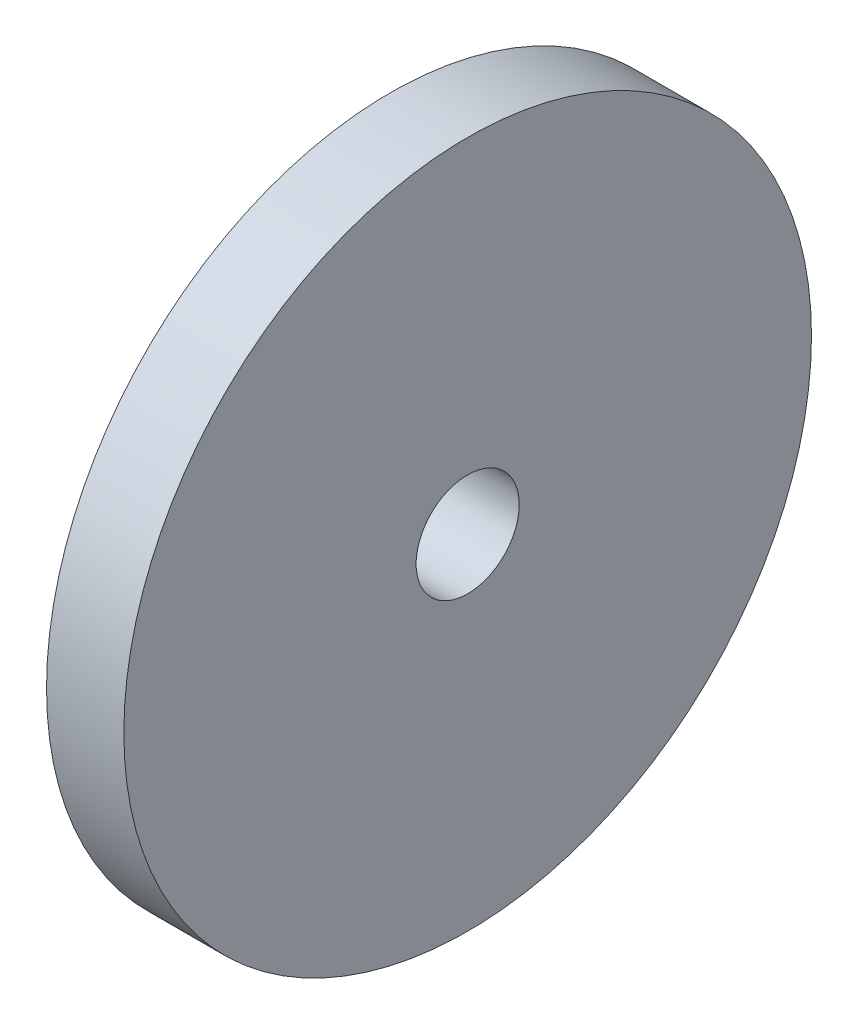
ISO-10303-21;
HEADER;
FILE_DESCRIPTION(('STEP AP214'),'2;1');
FILE_NAME('part.step','',(''),(''),'','','');
FILE_SCHEMA(('AUTOMOTIVE_DESIGN { 1 0 10303 214 1 1 1 1 }'));
ENDSEC;
DATA;
#1=APPLICATION_CONTEXT('core data for automotive mechanical design processes');
#2=APPLICATION_PROTOCOL_DEFINITION('international standard','automotive_design',2000,#1);
#3=PRODUCT_CONTEXT('',#1,'mechanical');
#4=PRODUCT('Part','Part','',(#3));
#5=PRODUCT_RELATED_PRODUCT_CATEGORY('part','',(#4));
#6=PRODUCT_DEFINITION_FORMATION('','',#4);
#7=PRODUCT_DEFINITION_CONTEXT('part definition',#1,'design');
#8=PRODUCT_DEFINITION('design','',#6,#7);
#9=PRODUCT_DEFINITION_SHAPE('','',#8);
#10=(LENGTH_UNIT() NAMED_UNIT(*) SI_UNIT(.MILLI.,.METRE.));
#11=(NAMED_UNIT(*) PLANE_ANGLE_UNIT() SI_UNIT($,.RADIAN.));
#12=(NAMED_UNIT(*) SI_UNIT($,.STERADIAN.) SOLID_ANGLE_UNIT());
#13=UNCERTAINTY_MEASURE_WITH_UNIT(LENGTH_MEASURE(1.E-05),#10,'distance_accuracy_value','');
#14=(GEOMETRIC_REPRESENTATION_CONTEXT(3) GLOBAL_UNCERTAINTY_ASSIGNED_CONTEXT((#13)) GLOBAL_UNIT_ASSIGNED_CONTEXT((#10,
#11,#12)) REPRESENTATION_CONTEXT('',''));
#15=CARTESIAN_POINT('',(0.,0.,0.));
#16=DIRECTION('',(0.,0.,1.));
#17=DIRECTION('',(1.,0.,0.));
#18=AXIS2_PLACEMENT_3D('',#15,#16,#17);
#19=CARTESIAN_POINT('',(7.5,0.,0.));
#20=DIRECTION('',(1.,0.,0.));
#21=DIRECTION('',(0.,0.,-1.));
#22=AXIS2_PLACEMENT_3D('',#19,#20,#21);
#23=PLANE('',#22);
#24=CARTESIAN_POINT('',(7.5,0.,0.));
#25=DIRECTION('',(1.,0.,0.));
#26=DIRECTION('',(0.,0.,-1.));
#27=AXIS2_PLACEMENT_3D('',#24,#25,#26);
#28=CIRCLE('',#27,33.35);
#29=CARTESIAN_POINT('',(7.5,0.,-33.35));
#30=VERTEX_POINT('',#29);
#31=EDGE_CURVE('E10',#30,#30,#28,.T.);
#32=ORIENTED_EDGE('',*,*,#31,.T.);
#33=EDGE_LOOP('',(#32));
#34=FACE_BOUND('',#33,.T.);
#35=CARTESIAN_POINT('',(7.5,0.,0.));
#36=DIRECTION('',(1.,0.,0.));
#37=DIRECTION('',(0.,0.,-1.));
#38=AXIS2_PLACEMENT_3D('',#35,#36,#37);
#39=CIRCLE('',#38,5.);
#40=CARTESIAN_POINT('',(7.5,0.,-5.));
#41=VERTEX_POINT('',#40);
#42=EDGE_CURVE('E42',#41,#41,#39,.T.);
#43=ORIENTED_EDGE('',*,*,#42,.F.);
#44=EDGE_LOOP('',(#43));
#45=FACE_BOUND('',#44,.T.);
#46=ADVANCED_FACE('F31',(#34,#45),#23,.T.);
#47=CARTESIAN_POINT('',(0.,0.,0.));
#48=DIRECTION('',(1.,0.,0.));
#49=DIRECTION('',(0.,0.,-1.));
#50=AXIS2_PLACEMENT_3D('',#47,#48,#49);
#51=PLANE('',#50);
#52=CARTESIAN_POINT('',(0.,0.,0.));
#53=DIRECTION('',(1.,0.,0.));
#54=DIRECTION('',(0.,0.,-1.));
#55=AXIS2_PLACEMENT_3D('',#52,#53,#54);
#56=CIRCLE('',#55,33.35);
#57=CARTESIAN_POINT('',(0.,0.,-33.35));
#58=VERTEX_POINT('',#57);
#59=EDGE_CURVE('E35',#58,#58,#56,.T.);
#60=ORIENTED_EDGE('',*,*,#59,.F.);
#61=EDGE_LOOP('',(#60));
#62=FACE_BOUND('',#61,.T.);
#63=CARTESIAN_POINT('',(0.,0.,0.));
#64=DIRECTION('',(1.,0.,0.));
#65=DIRECTION('',(0.,0.,-1.));
#66=AXIS2_PLACEMENT_3D('',#63,#64,#65);
#67=CIRCLE('',#66,5.);
#68=CARTESIAN_POINT('',(0.,0.,-5.));
#69=VERTEX_POINT('',#68);
#70=EDGE_CURVE('E44',#69,#69,#67,.T.);
#71=ORIENTED_EDGE('',*,*,#70,.T.);
#72=EDGE_LOOP('',(#71));
#73=FACE_BOUND('',#72,.T.);
#74=ADVANCED_FACE('F54',(#62,#73),#51,.F.);
#75=CARTESIAN_POINT('',(7.5,0.,0.));
#76=DIRECTION('',(-1.,0.,0.));
#77=DIRECTION('',(0.,0.,1.));
#78=AXIS2_PLACEMENT_3D('',#75,#76,#77);
#79=CYLINDRICAL_SURFACE('',#78,33.35);
#80=ORIENTED_EDGE('',*,*,#31,.F.);
#81=EDGE_LOOP('',(#80));
#82=FACE_BOUND('',#81,.T.);
#83=ORIENTED_EDGE('',*,*,#59,.T.);
#84=EDGE_LOOP('',(#83));
#85=FACE_BOUND('',#84,.T.);
#86=ADVANCED_FACE('F33',(#82,#85),#79,.T.);
#87=CARTESIAN_POINT('',(7.5,0.,0.));
#88=DIRECTION('',(-1.,0.,0.));
#89=DIRECTION('',(0.,0.,1.));
#90=AXIS2_PLACEMENT_3D('',#87,#88,#89);
#91=CYLINDRICAL_SURFACE('',#90,5.);
#92=ORIENTED_EDGE('',*,*,#42,.T.);
#93=EDGE_LOOP('',(#92));
#94=FACE_BOUND('',#93,.T.);
#95=ORIENTED_EDGE('',*,*,#70,.F.);
#96=EDGE_LOOP('',(#95));
#97=FACE_BOUND('',#96,.T.);
#98=ADVANCED_FACE('F50',(#94,#97),#91,.F.);
#99=CLOSED_SHELL('',(#46,#74,#86,#98));
#100=MANIFOLD_SOLID_BREP('B2',#99);
#101=ADVANCED_BREP_SHAPE_REPRESENTATION('',(#18,#100),#14);
#102=SHAPE_DEFINITION_REPRESENTATION(#9,#101);
ENDSEC;
END-ISO-10303-21;
